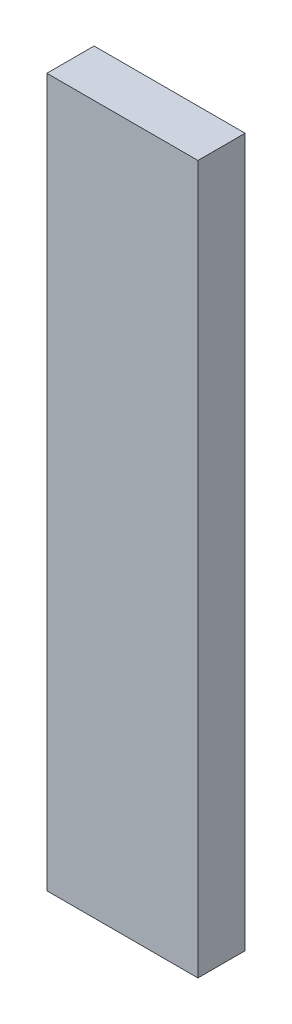
ISO-10303-21;
HEADER;
FILE_DESCRIPTION(('STEP AP214'),'2;1');
FILE_NAME('part.step','',(''),(''),'','','');
FILE_SCHEMA(('AUTOMOTIVE_DESIGN { 1 0 10303 214 1 1 1 1 }'));
ENDSEC;
DATA;
#1=APPLICATION_CONTEXT('core data for automotive mechanical design processes');
#2=APPLICATION_PROTOCOL_DEFINITION('international standard','automotive_design',2000,#1);
#3=PRODUCT_CONTEXT('',#1,'mechanical');
#4=PRODUCT('Part','Part','',(#3));
#5=PRODUCT_RELATED_PRODUCT_CATEGORY('part','',(#4));
#6=PRODUCT_DEFINITION_FORMATION('','',#4);
#7=PRODUCT_DEFINITION_CONTEXT('part definition',#1,'design');
#8=PRODUCT_DEFINITION('design','',#6,#7);
#9=PRODUCT_DEFINITION_SHAPE('','',#8);
#10=(LENGTH_UNIT() NAMED_UNIT(*) SI_UNIT(.MILLI.,.METRE.));
#11=(NAMED_UNIT(*) PLANE_ANGLE_UNIT() SI_UNIT($,.RADIAN.));
#12=(NAMED_UNIT(*) SI_UNIT($,.STERADIAN.) SOLID_ANGLE_UNIT());
#13=UNCERTAINTY_MEASURE_WITH_UNIT(LENGTH_MEASURE(1.E-05),#10,'distance_accuracy_value','');
#14=(GEOMETRIC_REPRESENTATION_CONTEXT(3) GLOBAL_UNCERTAINTY_ASSIGNED_CONTEXT((#13)) GLOBAL_UNIT_ASSIGNED_CONTEXT((#10,
#11,#12)) REPRESENTATION_CONTEXT('',''));
#15=CARTESIAN_POINT('',(0.,0.,0.));
#16=DIRECTION('',(0.,0.,1.));
#17=DIRECTION('',(1.,0.,0.));
#18=AXIS2_PLACEMENT_3D('',#15,#16,#17);
#19=CARTESIAN_POINT('',(0.37,-0.1875,0.3075));
#20=DIRECTION('',(-1.,0.,0.));
#21=DIRECTION('',(0.,0.,1.));
#22=AXIS2_PLACEMENT_3D('',#19,#20,#21);
#23=PLANE('',#22);
#24=DIRECTION('',(0.,0.,-1.));
#25=VECTOR('',#24,1.);
#26=CARTESIAN_POINT('',(0.37,0.1875,0.3075));
#27=LINE('',#26,#25);
#28=CARTESIAN_POINT('',(0.37,0.1875,0.32));
#29=VERTEX_POINT('',#28);
#30=CARTESIAN_POINT('',(0.37,0.1875,0.295));
#31=VERTEX_POINT('',#30);
#32=EDGE_CURVE('E11',#29,#31,#27,.T.);
#33=ORIENTED_EDGE('',*,*,#32,.T.);
#34=DIRECTION('',(0.,1.,0.));
#35=VECTOR('',#34,1.);
#36=CARTESIAN_POINT('',(0.37,-0.1875,0.295));
#37=LINE('',#36,#35);
#38=CARTESIAN_POINT('',(0.37,-0.1875,0.295));
#39=VERTEX_POINT('',#38);
#40=EDGE_CURVE('E40',#39,#31,#37,.T.);
#41=ORIENTED_EDGE('',*,*,#40,.F.);
#42=DIRECTION('',(0.,0.,-1.));
#43=VECTOR('',#42,1.);
#44=CARTESIAN_POINT('',(0.37,-0.1875,0.3075));
#45=LINE('',#44,#43);
#46=CARTESIAN_POINT('',(0.37,-0.1875,0.32));
#47=VERTEX_POINT('',#46);
#48=EDGE_CURVE('E107',#47,#39,#45,.T.);
#49=ORIENTED_EDGE('',*,*,#48,.F.);
#50=DIRECTION('',(0.,1.,0.));
#51=VECTOR('',#50,1.);
#52=CARTESIAN_POINT('',(0.37,-0.1875,0.32));
#53=LINE('',#52,#51);
#54=EDGE_CURVE('E27',#47,#29,#53,.T.);
#55=ORIENTED_EDGE('',*,*,#54,.T.);
#56=EDGE_LOOP('',(#33,#41,#49,#55));
#57=FACE_BOUND('',#56,.T.);
#58=ADVANCED_FACE('F17',(#57),#23,.T.);
#59=CARTESIAN_POINT('',(0.41,-0.1875,0.3075));
#60=DIRECTION('',(0.,-1.,0.));
#61=DIRECTION('',(0.,0.,-1.));
#62=AXIS2_PLACEMENT_3D('',#59,#60,#61);
#63=PLANE('',#62);
#64=DIRECTION('',(-1.,0.,0.));
#65=VECTOR('',#64,1.);
#66=CARTESIAN_POINT('',(0.41,-0.1875,0.32));
#67=LINE('',#66,#65);
#68=CARTESIAN_POINT('',(0.45,-0.1875,0.32));
#69=VERTEX_POINT('',#68);
#70=EDGE_CURVE('E70',#69,#47,#67,.T.);
#71=ORIENTED_EDGE('',*,*,#70,.T.);
#72=ORIENTED_EDGE('',*,*,#48,.T.);
#73=DIRECTION('',(-1.,0.,0.));
#74=VECTOR('',#73,1.);
#75=CARTESIAN_POINT('',(0.41,-0.1875,0.295));
#76=LINE('',#75,#74);
#77=CARTESIAN_POINT('',(0.45,-0.1875,0.295));
#78=VERTEX_POINT('',#77);
#79=EDGE_CURVE('E105',#78,#39,#76,.T.);
#80=ORIENTED_EDGE('',*,*,#79,.F.);
#81=DIRECTION('',(0.,0.,-1.));
#82=VECTOR('',#81,1.);
#83=CARTESIAN_POINT('',(0.45,-0.1875,0.3075));
#84=LINE('',#83,#82);
#85=EDGE_CURVE('E75',#69,#78,#84,.T.);
#86=ORIENTED_EDGE('',*,*,#85,.F.);
#87=EDGE_LOOP('',(#71,#72,#80,#86));
#88=FACE_BOUND('',#87,.T.);
#89=ADVANCED_FACE('F106',(#88),#63,.T.);
#90=CARTESIAN_POINT('',(0.41,-0.1875,0.295));
#91=DIRECTION('',(0.,0.,1.));
#92=DIRECTION('',(1.,0.,0.));
#93=AXIS2_PLACEMENT_3D('',#90,#91,#92);
#94=PLANE('',#93);
#95=DIRECTION('',(-1.,0.,0.));
#96=VECTOR('',#95,1.);
#97=CARTESIAN_POINT('',(0.41,0.1875,0.295));
#98=LINE('',#97,#96);
#99=CARTESIAN_POINT('',(0.45,0.1875,0.295));
#100=VERTEX_POINT('',#99);
#101=EDGE_CURVE('E89',#100,#31,#98,.T.);
#102=ORIENTED_EDGE('',*,*,#101,.F.);
#103=DIRECTION('',(0.,1.,0.));
#104=VECTOR('',#103,1.);
#105=CARTESIAN_POINT('',(0.45,-0.1875,0.295));
#106=LINE('',#105,#104);
#107=EDGE_CURVE('E87',#78,#100,#106,.T.);
#108=ORIENTED_EDGE('',*,*,#107,.F.);
#109=ORIENTED_EDGE('',*,*,#79,.T.);
#110=ORIENTED_EDGE('',*,*,#40,.T.);
#111=EDGE_LOOP('',(#102,#108,#109,#110));
#112=FACE_BOUND('',#111,.T.);
#113=ADVANCED_FACE('F110',(#112),#94,.F.);
#114=CARTESIAN_POINT('',(0.41,-0.1875,0.32));
#115=DIRECTION('',(0.,0.,1.));
#116=DIRECTION('',(1.,0.,0.));
#117=AXIS2_PLACEMENT_3D('',#114,#115,#116);
#118=PLANE('',#117);
#119=DIRECTION('',(-1.,0.,0.));
#120=VECTOR('',#119,1.);
#121=CARTESIAN_POINT('',(0.41,0.1875,0.32));
#122=LINE('',#121,#120);
#123=CARTESIAN_POINT('',(0.45,0.1875,0.32));
#124=VERTEX_POINT('',#123);
#125=EDGE_CURVE('E68',#124,#29,#122,.T.);
#126=ORIENTED_EDGE('',*,*,#125,.T.);
#127=ORIENTED_EDGE('',*,*,#54,.F.);
#128=ORIENTED_EDGE('',*,*,#70,.F.);
#129=DIRECTION('',(0.,1.,0.));
#130=VECTOR('',#129,1.);
#131=CARTESIAN_POINT('',(0.45,-0.1875,0.32));
#132=LINE('',#131,#130);
#133=EDGE_CURVE('E64',#69,#124,#132,.T.);
#134=ORIENTED_EDGE('',*,*,#133,.T.);
#135=EDGE_LOOP('',(#126,#127,#128,#134));
#136=FACE_BOUND('',#135,.T.);
#137=ADVANCED_FACE('F66',(#136),#118,.T.);
#138=CARTESIAN_POINT('',(0.45,-0.1875,0.3075));
#139=DIRECTION('',(-1.,0.,0.));
#140=DIRECTION('',(0.,0.,1.));
#141=AXIS2_PLACEMENT_3D('',#138,#139,#140);
#142=PLANE('',#141);
#143=DIRECTION('',(0.,0.,-1.));
#144=VECTOR('',#143,1.);
#145=CARTESIAN_POINT('',(0.45,0.1875,0.3075));
#146=LINE('',#145,#144);
#147=EDGE_CURVE('E81',#124,#100,#146,.T.);
#148=ORIENTED_EDGE('',*,*,#147,.F.);
#149=ORIENTED_EDGE('',*,*,#133,.F.);
#150=ORIENTED_EDGE('',*,*,#85,.T.);
#151=ORIENTED_EDGE('',*,*,#107,.T.);
#152=EDGE_LOOP('',(#148,#149,#150,#151));
#153=FACE_BOUND('',#152,.T.);
#154=ADVANCED_FACE('F85',(#153),#142,.F.);
#155=CARTESIAN_POINT('',(0.41,0.1875,0.3075));
#156=DIRECTION('',(0.,-1.,0.));
#157=DIRECTION('',(0.,0.,-1.));
#158=AXIS2_PLACEMENT_3D('',#155,#156,#157);
#159=PLANE('',#158);
#160=ORIENTED_EDGE('',*,*,#125,.F.);
#161=ORIENTED_EDGE('',*,*,#147,.T.);
#162=ORIENTED_EDGE('',*,*,#101,.T.);
#163=ORIENTED_EDGE('',*,*,#32,.F.);
#164=EDGE_LOOP('',(#160,#161,#162,#163));
#165=FACE_BOUND('',#164,.T.);
#166=ADVANCED_FACE('F19',(#165),#159,.F.);
#167=CLOSED_SHELL('',(#58,#89,#113,#137,#154,#166));
#168=MANIFOLD_SOLID_BREP('B1',#167);
#169=ADVANCED_BREP_SHAPE_REPRESENTATION('',(#18,#168),#14);
#170=SHAPE_DEFINITION_REPRESENTATION(#9,#169);
ENDSEC;
END-ISO-10303-21;
